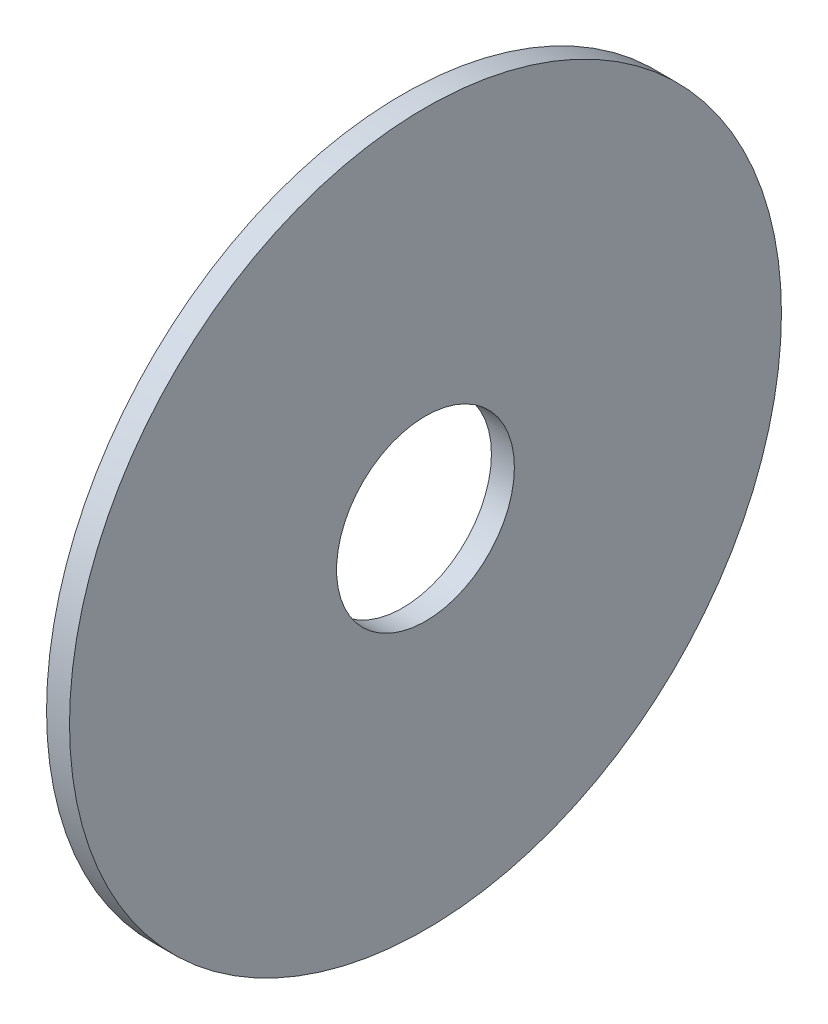
ISO-10303-21;
HEADER;
FILE_DESCRIPTION(('STEP AP214'),'2;1');
FILE_NAME('part.step','',(''),(''),'','','');
FILE_SCHEMA(('AUTOMOTIVE_DESIGN { 1 0 10303 214 1 1 1 1 }'));
ENDSEC;
DATA;
#1=APPLICATION_CONTEXT('core data for automotive mechanical design processes');
#2=APPLICATION_PROTOCOL_DEFINITION('international standard','automotive_design',2000,#1);
#3=PRODUCT_CONTEXT('',#1,'mechanical');
#4=PRODUCT('Part','Part','',(#3));
#5=PRODUCT_RELATED_PRODUCT_CATEGORY('part','',(#4));
#6=PRODUCT_DEFINITION_FORMATION('','',#4);
#7=PRODUCT_DEFINITION_CONTEXT('part definition',#1,'design');
#8=PRODUCT_DEFINITION('design','',#6,#7);
#9=PRODUCT_DEFINITION_SHAPE('','',#8);
#10=(LENGTH_UNIT() NAMED_UNIT(*) SI_UNIT(.MILLI.,.METRE.));
#11=(NAMED_UNIT(*) PLANE_ANGLE_UNIT() SI_UNIT($,.RADIAN.));
#12=(NAMED_UNIT(*) SI_UNIT($,.STERADIAN.) SOLID_ANGLE_UNIT());
#13=UNCERTAINTY_MEASURE_WITH_UNIT(LENGTH_MEASURE(1.E-05),#10,'distance_accuracy_value','');
#14=(GEOMETRIC_REPRESENTATION_CONTEXT(3) GLOBAL_UNCERTAINTY_ASSIGNED_CONTEXT((#13)) GLOBAL_UNIT_ASSIGNED_CONTEXT((#10,
#11,#12)) REPRESENTATION_CONTEXT('',''));
#15=CARTESIAN_POINT('',(0.,0.,0.));
#16=DIRECTION('',(0.,0.,1.));
#17=DIRECTION('',(1.,0.,0.));
#18=AXIS2_PLACEMENT_3D('',#15,#16,#17);
#19=CARTESIAN_POINT('',(4.52,0.,0.));
#20=DIRECTION('',(1.,0.,0.));
#21=DIRECTION('',(0.,0.,-1.));
#22=AXIS2_PLACEMENT_3D('',#19,#20,#21);
#23=PLANE('',#22);
#24=CARTESIAN_POINT('',(4.52,0.,0.));
#25=DIRECTION('',(1.,0.,0.));
#26=DIRECTION('',(0.,0.,-1.));
#27=AXIS2_PLACEMENT_3D('',#24,#25,#26);
#28=CIRCLE('',#27,70.07);
#29=CARTESIAN_POINT('',(4.52,0.,-70.07));
#30=VERTEX_POINT('',#29);
#31=EDGE_CURVE('E10',#30,#30,#28,.T.);
#32=ORIENTED_EDGE('',*,*,#31,.T.);
#33=EDGE_LOOP('',(#32));
#34=FACE_BOUND('',#33,.T.);
#35=CARTESIAN_POINT('',(4.52,0.,0.));
#36=DIRECTION('',(1.,0.,0.));
#37=DIRECTION('',(0.,0.,-1.));
#38=AXIS2_PLACEMENT_3D('',#35,#36,#37);
#39=CIRCLE('',#38,17.5);
#40=CARTESIAN_POINT('',(4.52,0.,-17.5));
#41=VERTEX_POINT('',#40);
#42=EDGE_CURVE('E58',#41,#41,#39,.T.);
#43=ORIENTED_EDGE('',*,*,#42,.F.);
#44=EDGE_LOOP('',(#43));
#45=FACE_BOUND('',#44,.T.);
#46=ADVANCED_FACE('F45',(#34,#45),#23,.T.);
#47=CARTESIAN_POINT('',(0.,0.,0.));
#48=DIRECTION('',(1.,0.,0.));
#49=DIRECTION('',(0.,0.,-1.));
#50=AXIS2_PLACEMENT_3D('',#47,#48,#49);
#51=PLANE('',#50);
#52=CARTESIAN_POINT('',(0.,0.,0.));
#53=DIRECTION('',(1.,0.,0.));
#54=DIRECTION('',(0.,0.,-1.));
#55=AXIS2_PLACEMENT_3D('',#52,#53,#54);
#56=CIRCLE('',#55,70.07);
#57=CARTESIAN_POINT('',(0.,0.,-70.07));
#58=VERTEX_POINT('',#57);
#59=EDGE_CURVE('E49',#58,#58,#56,.T.);
#60=ORIENTED_EDGE('',*,*,#59,.F.);
#61=EDGE_LOOP('',(#60));
#62=FACE_BOUND('',#61,.T.);
#63=CARTESIAN_POINT('',(0.,0.,0.));
#64=DIRECTION('',(1.,0.,0.));
#65=DIRECTION('',(0.,0.,-1.));
#66=AXIS2_PLACEMENT_3D('',#63,#64,#65);
#67=CIRCLE('',#66,17.5);
#68=CARTESIAN_POINT('',(0.,0.,-17.5));
#69=VERTEX_POINT('',#68);
#70=EDGE_CURVE('E60',#69,#69,#67,.T.);
#71=ORIENTED_EDGE('',*,*,#70,.T.);
#72=EDGE_LOOP('',(#71));
#73=FACE_BOUND('',#72,.T.);
#74=ADVANCED_FACE('F72',(#62,#73),#51,.F.);
#75=CARTESIAN_POINT('',(4.52,0.,0.));
#76=DIRECTION('',(-1.,0.,0.));
#77=DIRECTION('',(0.,0.,1.));
#78=AXIS2_PLACEMENT_3D('',#75,#76,#77);
#79=CYLINDRICAL_SURFACE('',#78,70.07);
#80=ORIENTED_EDGE('',*,*,#31,.F.);
#81=EDGE_LOOP('',(#80));
#82=FACE_BOUND('',#81,.T.);
#83=ORIENTED_EDGE('',*,*,#59,.T.);
#84=EDGE_LOOP('',(#83));
#85=FACE_BOUND('',#84,.T.);
#86=ADVANCED_FACE('F47',(#82,#85),#79,.T.);
#87=CARTESIAN_POINT('',(4.52,0.,0.));
#88=DIRECTION('',(-1.,0.,0.));
#89=DIRECTION('',(0.,0.,1.));
#90=AXIS2_PLACEMENT_3D('',#87,#88,#89);
#91=CYLINDRICAL_SURFACE('',#90,17.5);
#92=ORIENTED_EDGE('',*,*,#42,.T.);
#93=EDGE_LOOP('',(#92));
#94=FACE_BOUND('',#93,.T.);
#95=ORIENTED_EDGE('',*,*,#70,.F.);
#96=EDGE_LOOP('',(#95));
#97=FACE_BOUND('',#96,.T.);
#98=ADVANCED_FACE('F68',(#94,#97),#91,.F.);
#99=CLOSED_SHELL('',(#46,#74,#86,#98));
#100=MANIFOLD_SOLID_BREP('B2',#99);
#101=ADVANCED_BREP_SHAPE_REPRESENTATION('',(#18,#100),#14);
#102=SHAPE_DEFINITION_REPRESENTATION(#9,#101);
ENDSEC;
END-ISO-10303-21;
